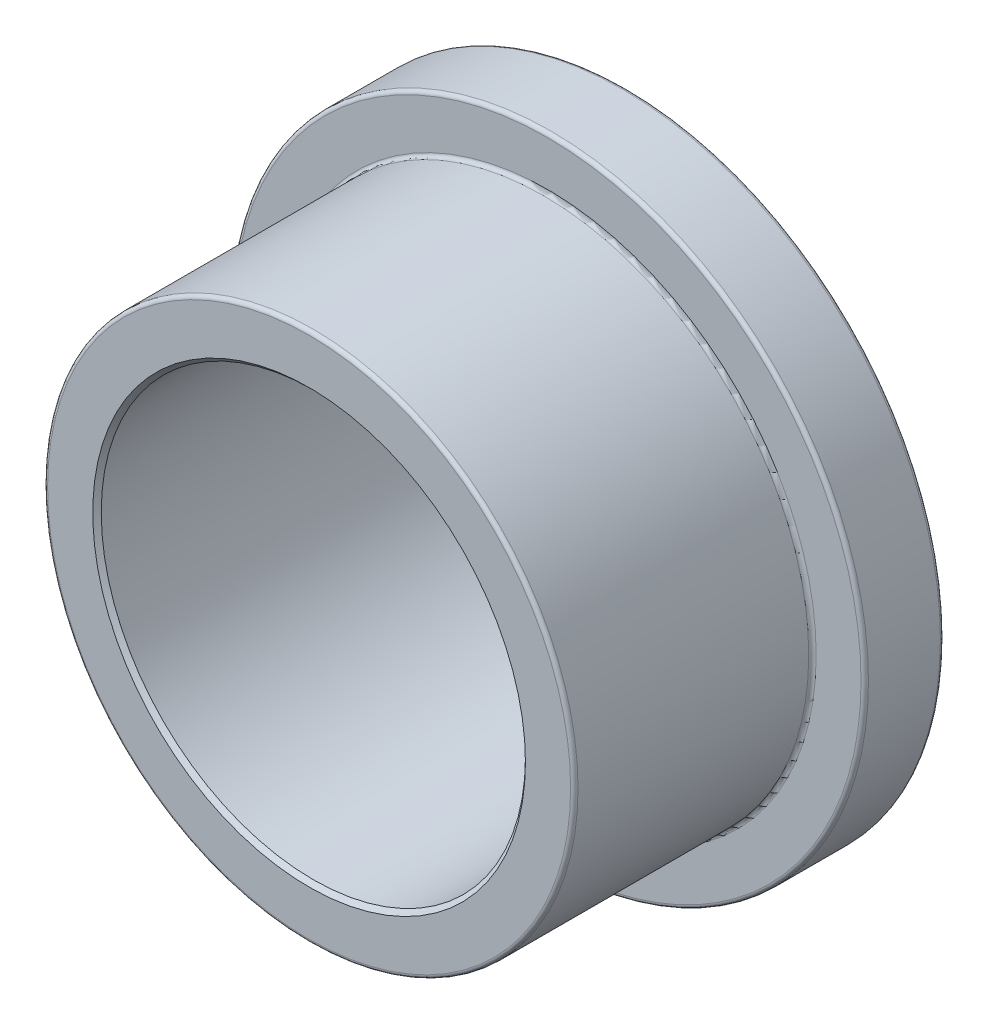
ISO-10303-21;
HEADER;
FILE_DESCRIPTION(('STEP AP214'),'2;1');
FILE_NAME('part.step','',(''),(''),'','','');
FILE_SCHEMA(('AUTOMOTIVE_DESIGN { 1 0 10303 214 1 1 1 1 }'));
ENDSEC;
DATA;
#1=APPLICATION_CONTEXT('core data for automotive mechanical design processes');
#2=APPLICATION_PROTOCOL_DEFINITION('international standard','automotive_design',2000,#1);
#3=PRODUCT_CONTEXT('',#1,'mechanical');
#4=PRODUCT('Part','Part','',(#3));
#5=PRODUCT_RELATED_PRODUCT_CATEGORY('part','',(#4));
#6=PRODUCT_DEFINITION_FORMATION('','',#4);
#7=PRODUCT_DEFINITION_CONTEXT('part definition',#1,'design');
#8=PRODUCT_DEFINITION('design','',#6,#7);
#9=PRODUCT_DEFINITION_SHAPE('','',#8);
#10=(LENGTH_UNIT() NAMED_UNIT(*) SI_UNIT(.MILLI.,.METRE.));
#11=(NAMED_UNIT(*) PLANE_ANGLE_UNIT() SI_UNIT($,.RADIAN.));
#12=(NAMED_UNIT(*) SI_UNIT($,.STERADIAN.) SOLID_ANGLE_UNIT());
#13=UNCERTAINTY_MEASURE_WITH_UNIT(LENGTH_MEASURE(1.E-05),#10,'distance_accuracy_value','');
#14=(GEOMETRIC_REPRESENTATION_CONTEXT(3) GLOBAL_UNCERTAINTY_ASSIGNED_CONTEXT((#13)) GLOBAL_UNIT_ASSIGNED_CONTEXT((#10,
#11,#12)) REPRESENTATION_CONTEXT('',''));
#15=CARTESIAN_POINT('',(0.,0.,0.));
#16=DIRECTION('',(0.,0.,1.));
#17=DIRECTION('',(1.,0.,0.));
#18=AXIS2_PLACEMENT_3D('',#15,#16,#17);
#19=CARTESIAN_POINT('',(0.,0.,19.05));
#20=DIRECTION('',(0.,0.,1.));
#21=DIRECTION('',(1.,0.,0.));
#22=AXIS2_PLACEMENT_3D('',#19,#20,#21);
#23=PLANE('',#22);
#24=CARTESIAN_POINT('',(0.,0.,19.05));
#25=DIRECTION('',(0.,0.,1.));
#26=DIRECTION('',(1.,0.,0.));
#27=AXIS2_PLACEMENT_3D('',#24,#25,#26);
#28=CIRCLE('',#27,15.6903166);
#29=CARTESIAN_POINT('',(15.6903166,0.,19.05));
#30=VERTEX_POINT('',#29);
#31=EDGE_CURVE('E10',#30,#30,#28,.T.);
#32=ORIENTED_EDGE('',*,*,#31,.T.);
#33=EDGE_LOOP('',(#32));
#34=FACE_BOUND('',#33,.T.);
#35=CARTESIAN_POINT('',(0.,0.,19.05));
#36=DIRECTION('',(0.,0.,1.));
#37=DIRECTION('',(1.,0.,0.));
#38=AXIS2_PLACEMENT_3D('',#35,#36,#37);
#39=CIRCLE('',#38,12.979908);
#40=CARTESIAN_POINT('',(12.979908,0.,19.05));
#41=VERTEX_POINT('',#40);
#42=EDGE_CURVE('E62',#41,#41,#39,.F.);
#43=ORIENTED_EDGE('',*,*,#42,.T.);
#44=EDGE_LOOP('',(#43));
#45=FACE_BOUND('',#44,.T.);
#46=ADVANCED_FACE('F30',(#34,#45),#23,.T.);
#47=CARTESIAN_POINT('',(0.,0.,0.));
#48=DIRECTION('',(0.,0.,1.));
#49=DIRECTION('',(1.,0.,0.));
#50=AXIS2_PLACEMENT_3D('',#47,#48,#49);
#51=PLANE('',#50);
#52=CARTESIAN_POINT('',(0.,0.,0.));
#53=DIRECTION('',(0.,0.,1.));
#54=DIRECTION('',(1.,0.,0.));
#55=AXIS2_PLACEMENT_3D('',#52,#53,#54);
#56=CIRCLE('',#55,18.8272166);
#57=CARTESIAN_POINT('',(18.8272166,0.,0.));
#58=VERTEX_POINT('',#57);
#59=EDGE_CURVE('E53',#58,#58,#56,.F.);
#60=ORIENTED_EDGE('',*,*,#59,.T.);
#61=EDGE_LOOP('',(#60));
#62=FACE_BOUND('',#61,.T.);
#63=CARTESIAN_POINT('',(0.,0.,0.));
#64=DIRECTION('',(0.,0.,1.));
#65=DIRECTION('',(1.,0.,0.));
#66=AXIS2_PLACEMENT_3D('',#63,#64,#65);
#67=CIRCLE('',#66,12.979908);
#68=CARTESIAN_POINT('',(12.979908,0.,0.));
#69=VERTEX_POINT('',#68);
#70=EDGE_CURVE('E71',#69,#69,#67,.T.);
#71=ORIENTED_EDGE('',*,*,#70,.T.);
#72=EDGE_LOOP('',(#71));
#73=FACE_BOUND('',#72,.T.);
#74=ADVANCED_FACE('F75',(#62,#73),#51,.F.);
#75=CARTESIAN_POINT('',(0.,0.,19.05));
#76=DIRECTION('',(0.,0.,-1.));
#77=DIRECTION('',(-1.,0.,0.));
#78=AXIS2_PLACEMENT_3D('',#75,#76,#77);
#79=CYLINDRICAL_SURFACE('',#78,15.9131);
#80=CARTESIAN_POINT('',(0.,0.,4.9852834));
#81=DIRECTION('',(0.,0.,1.));
#82=DIRECTION('',(1.,0.,0.));
#83=AXIS2_PLACEMENT_3D('',#80,#81,#82);
#84=CIRCLE('',#83,15.9131);
#85=CARTESIAN_POINT('',(-15.9131,0.,4.9852834));
#86=VERTEX_POINT('',#85);
#87=EDGE_CURVE('E37',#86,#86,#84,.T.);
#88=CARTESIAN_POINT('',(0.,0.,18.8272166));
#89=DIRECTION('',(0.,0.,1.));
#90=DIRECTION('',(1.,0.,0.));
#91=AXIS2_PLACEMENT_3D('',#88,#89,#90);
#92=CIRCLE('',#91,15.9131);
#93=CARTESIAN_POINT('',(-15.9131,0.,18.8272166));
#94=VERTEX_POINT('',#93);
#95=EDGE_CURVE('E41',#94,#94,#92,.F.);
#96=CARTESIAN_POINT('',(-15.9131,0.,4.9852834));
#97=CARTESIAN_POINT('',(-15.9131,0.,5.12947020416667));
#98=CARTESIAN_POINT('',(-15.9131,0.,5.27365700833333));
#99=CARTESIAN_POINT('',(-15.9131,0.,5.56203061666667));
#100=CARTESIAN_POINT('',(-15.9131,0.,5.70621742083333));
#101=CARTESIAN_POINT('',(-15.9131,0.,5.99459102916667));
#102=CARTESIAN_POINT('',(-15.9131,0.,6.13877783333333));
#103=CARTESIAN_POINT('',(-15.9131,0.,6.42715144166667));
#104=CARTESIAN_POINT('',(-15.9131,0.,6.57133824583333));
#105=CARTESIAN_POINT('',(-15.9131,0.,6.85971185416667));
#106=CARTESIAN_POINT('',(-15.9131,0.,7.00389865833333));
#107=CARTESIAN_POINT('',(-15.9131,0.,7.29227226666667));
#108=CARTESIAN_POINT('',(-15.9131,0.,7.43645907083333));
#109=CARTESIAN_POINT('',(-15.9131,0.,7.72483267916666));
#110=CARTESIAN_POINT('',(-15.9131,0.,7.86901948333333));
#111=CARTESIAN_POINT('',(-15.9131,0.,8.15739309166666));
#112=CARTESIAN_POINT('',(-15.9131,0.,8.30157989583333));
#113=CARTESIAN_POINT('',(-15.9131,0.,8.58995350416666));
#114=CARTESIAN_POINT('',(-15.9131,0.,8.73414030833333));
#115=CARTESIAN_POINT('',(-15.9131,0.,9.02251391666666));
#116=CARTESIAN_POINT('',(-15.9131,0.,9.16670072083333));
#117=CARTESIAN_POINT('',(-15.9131,0.,9.45507432916666));
#118=CARTESIAN_POINT('',(-15.9131,0.,9.59926113333333));
#119=CARTESIAN_POINT('',(-15.9131,0.,9.88763474166666));
#120=CARTESIAN_POINT('',(-15.9131,0.,10.0318215458333));
#121=CARTESIAN_POINT('',(-15.9131,0.,10.3201951541667));
#122=CARTESIAN_POINT('',(-15.9131,0.,10.4643819583333));
#123=CARTESIAN_POINT('',(-15.9131,0.,10.7527555666667));
#124=CARTESIAN_POINT('',(-15.9131,0.,10.8969423708333));
#125=CARTESIAN_POINT('',(-15.9131,0.,11.1853159791667));
#126=CARTESIAN_POINT('',(-15.9131,0.,11.3295027833333));
#127=CARTESIAN_POINT('',(-15.9131,0.,11.6178763916667));
#128=CARTESIAN_POINT('',(-15.9131,0.,11.7620631958333));
#129=CARTESIAN_POINT('',(-15.9131,0.,12.0504368041667));
#130=CARTESIAN_POINT('',(-15.9131,0.,12.1946236083333));
#131=CARTESIAN_POINT('',(-15.9131,0.,12.4829972166667));
#132=CARTESIAN_POINT('',(-15.9131,0.,12.6271840208333));
#133=CARTESIAN_POINT('',(-15.9131,0.,12.9155576291667));
#134=CARTESIAN_POINT('',(-15.9131,0.,13.0597444333333));
#135=CARTESIAN_POINT('',(-15.9131,0.,13.3481180416667));
#136=CARTESIAN_POINT('',(-15.9131,0.,13.4923048458333));
#137=CARTESIAN_POINT('',(-15.9131,0.,13.7806784541667));
#138=CARTESIAN_POINT('',(-15.9131,0.,13.9248652583333));
#139=CARTESIAN_POINT('',(-15.9131,0.,14.2132388666667));
#140=CARTESIAN_POINT('',(-15.9131,0.,14.3574256708333));
#141=CARTESIAN_POINT('',(-15.9131,0.,14.6457992791667));
#142=CARTESIAN_POINT('',(-15.9131,0.,14.7899860833333));
#143=CARTESIAN_POINT('',(-15.9131,0.,15.0783596916667));
#144=CARTESIAN_POINT('',(-15.9131,0.,15.2225464958333));
#145=CARTESIAN_POINT('',(-15.9131,0.,15.5109201041667));
#146=CARTESIAN_POINT('',(-15.9131,0.,15.6551069083333));
#147=CARTESIAN_POINT('',(-15.9131,0.,15.9434805166667));
#148=CARTESIAN_POINT('',(-15.9131,0.,16.0876673208333));
#149=CARTESIAN_POINT('',(-15.9131,0.,16.3760409291667));
#150=CARTESIAN_POINT('',(-15.9131,0.,16.5202277333333));
#151=CARTESIAN_POINT('',(-15.9131,0.,16.8086013416667));
#152=CARTESIAN_POINT('',(-15.9131,0.,16.9527881458333));
#153=CARTESIAN_POINT('',(-15.9131,0.,17.2411617541667));
#154=CARTESIAN_POINT('',(-15.9131,0.,17.3853485583333));
#155=CARTESIAN_POINT('',(-15.9131,0.,17.6737221666667));
#156=CARTESIAN_POINT('',(-15.9131,0.,17.8179089708333));
#157=CARTESIAN_POINT('',(-15.9131,0.,18.1062825791667));
#158=CARTESIAN_POINT('',(-15.9131,0.,18.2504693833333));
#159=CARTESIAN_POINT('',(-15.9131,0.,18.5388429916667));
#160=CARTESIAN_POINT('',(-15.9131,0.,18.6830297958333));
#161=CARTESIAN_POINT('',(-15.9131,0.,18.8272166));
#162=B_SPLINE_CURVE_WITH_KNOTS('',3,(#96,#97,#98,#99,#100,#101,#102,#103,#104,#105,#106,#107,
#108,#109,#110,#111,#112,#113,#114,#115,#116,#117,#118,#119,#120,#121,#122,#123,#124,#125,#126,
#127,#128,#129,#130,#131,#132,#133,#134,#135,#136,#137,#138,#139,#140,#141,#142,#143,#144,#145,
#146,#147,#148,#149,#150,#151,#152,#153,#154,#155,#156,#157,#158,#159,#160,#161),.UNSPECIFIED.,
.F.,.F.,(4,2,2,2,2,2,2,2,2,2,2,2,2,2,2,2,2,2,2,2,2,2,2,2,2,2,2,2,2,2,2,2,4),(0.,0.4325604125,
0.865120824999999,1.2976812375,1.73024165,2.1628020625,2.595362475,3.0279228875,3.4604833,
3.8930437125,4.325604125,4.7581645375,5.19072495,5.6232853625,6.055845775,6.4884061875,
6.92096659999999,7.35352701249999,7.78608742499999,8.21864783749999,8.65120824999999,
9.08376866249999,9.51632907499999,9.94888948749999,10.3814499,10.8140103125,11.246570725,
11.6791311375,12.11169155,12.5442519625,12.976812375,13.4093727875,13.8419332),.UNSPECIFIED.);
#163=EDGE_CURVE('BSEAM100',#86,#94,#162,.T.);
#164=ORIENTED_EDGE('',*,*,#87,.T.);
#165=ORIENTED_EDGE('',*,*,#95,.T.);
#166=ORIENTED_EDGE('',*,*,#163,.T.);
#167=ORIENTED_EDGE('',*,*,#163,.F.);
#168=EDGE_LOOP('',(#164,#166,#165,#167));
#169=FACE_BOUND('',#168,.T.);
#170=ADVANCED_FACE('F100',(#169),#79,.T.);
#171=CARTESIAN_POINT('',(0.,0.,19.05));
#172=DIRECTION('',(0.,0.,-1.));
#173=DIRECTION('',(-1.,0.,0.));
#174=AXIS2_PLACEMENT_3D('',#171,#172,#173);
#175=CYLINDRICAL_SURFACE('',#174,12.7254);
#176=CARTESIAN_POINT('',(0.,0.,0.25450799999998));
#177=DIRECTION('',(0.,0.,1.));
#178=DIRECTION('',(1.,0.,0.));
#179=AXIS2_PLACEMENT_3D('',#176,#177,#178);
#180=CIRCLE('',#179,12.7254);
#181=CARTESIAN_POINT('',(-12.7254,0.,0.254507999999976));
#182=VERTEX_POINT('',#181);
#183=EDGE_CURVE('E65',#182,#182,#180,.F.);
#184=CARTESIAN_POINT('',(0.,0.,18.795492));
#185=DIRECTION('',(0.,0.,1.));
#186=DIRECTION('',(1.,0.,0.));
#187=AXIS2_PLACEMENT_3D('',#184,#185,#186);
#188=CIRCLE('',#187,12.7254);
#189=CARTESIAN_POINT('',(-12.7254,0.,18.795492));
#190=VERTEX_POINT('',#189);
#191=EDGE_CURVE('E68',#190,#190,#188,.T.);
#192=CARTESIAN_POINT('',(-12.7254,0.,0.254507999999976));
#193=CARTESIAN_POINT('',(-12.7254,0.,0.447643249999977));
#194=CARTESIAN_POINT('',(-12.7254,0.,0.640778499999977));
#195=CARTESIAN_POINT('',(-12.7254,0.,1.02704899999998));
#196=CARTESIAN_POINT('',(-12.7254,0.,1.22018424999998));
#197=CARTESIAN_POINT('',(-12.7254,0.,1.60645474999998));
#198=CARTESIAN_POINT('',(-12.7254,0.,1.79958999999998));
#199=CARTESIAN_POINT('',(-12.7254,0.,2.18586049999998));
#200=CARTESIAN_POINT('',(-12.7254,0.,2.37899574999997));
#201=CARTESIAN_POINT('',(-12.7254,0.,2.76526624999997));
#202=CARTESIAN_POINT('',(-12.7254,0.,2.95840149999998));
#203=CARTESIAN_POINT('',(-12.7254,0.,3.34467199999997));
#204=CARTESIAN_POINT('',(-12.7254,0.,3.53780724999997));
#205=CARTESIAN_POINT('',(-12.7254,0.,3.92407774999997));
#206=CARTESIAN_POINT('',(-12.7254,0.,4.11721299999997));
#207=CARTESIAN_POINT('',(-12.7254,0.,4.50348349999997));
#208=CARTESIAN_POINT('',(-12.7254,0.,4.69661874999997));
#209=CARTESIAN_POINT('',(-12.7254,0.,5.08288924999997));
#210=CARTESIAN_POINT('',(-12.7254,0.,5.27602449999997));
#211=CARTESIAN_POINT('',(-12.7254,0.,5.66229499999997));
#212=CARTESIAN_POINT('',(-12.7254,0.,5.85543024999997));
#213=CARTESIAN_POINT('',(-12.7254,0.,6.24170074999997));
#214=CARTESIAN_POINT('',(-12.7254,0.,6.43483599999997));
#215=CARTESIAN_POINT('',(-12.7254,0.,6.82110649999997));
#216=CARTESIAN_POINT('',(-12.7254,0.,7.01424174999997));
#217=CARTESIAN_POINT('',(-12.7254,0.,7.40051224999997));
#218=CARTESIAN_POINT('',(-12.7254,0.,7.59364749999997));
#219=CARTESIAN_POINT('',(-12.7254,0.,7.97991799999997));
#220=CARTESIAN_POINT('',(-12.7254,0.,8.17305324999997));
#221=CARTESIAN_POINT('',(-12.7254,0.,8.55932374999997));
#222=CARTESIAN_POINT('',(-12.7254,0.,8.75245899999997));
#223=CARTESIAN_POINT('',(-12.7254,0.,9.13872949999997));
#224=CARTESIAN_POINT('',(-12.7254,0.,9.33186474999997));
#225=CARTESIAN_POINT('',(-12.7254,0.,9.71813524999997));
#226=CARTESIAN_POINT('',(-12.7254,0.,9.91127049999997));
#227=CARTESIAN_POINT('',(-12.7254,0.,10.297541));
#228=CARTESIAN_POINT('',(-12.7254,0.,10.49067625));
#229=CARTESIAN_POINT('',(-12.7254,0.,10.87694675));
#230=CARTESIAN_POINT('',(-12.7254,0.,11.070082));
#231=CARTESIAN_POINT('',(-12.7254,0.,11.4563525));
#232=CARTESIAN_POINT('',(-12.7254,0.,11.64948775));
#233=CARTESIAN_POINT('',(-12.7254,0.,12.03575825));
#234=CARTESIAN_POINT('',(-12.7254,0.,12.2288935));
#235=CARTESIAN_POINT('',(-12.7254,0.,12.615164));
#236=CARTESIAN_POINT('',(-12.7254,0.,12.80829925));
#237=CARTESIAN_POINT('',(-12.7254,0.,13.19456975));
#238=CARTESIAN_POINT('',(-12.7254,0.,13.387705));
#239=CARTESIAN_POINT('',(-12.7254,0.,13.7739755));
#240=CARTESIAN_POINT('',(-12.7254,0.,13.96711075));
#241=CARTESIAN_POINT('',(-12.7254,0.,14.35338125));
#242=CARTESIAN_POINT('',(-12.7254,0.,14.5465165));
#243=CARTESIAN_POINT('',(-12.7254,0.,14.932787));
#244=CARTESIAN_POINT('',(-12.7254,0.,15.12592225));
#245=CARTESIAN_POINT('',(-12.7254,0.,15.51219275));
#246=CARTESIAN_POINT('',(-12.7254,0.,15.705328));
#247=CARTESIAN_POINT('',(-12.7254,0.,16.0915985));
#248=CARTESIAN_POINT('',(-12.7254,0.,16.28473375));
#249=CARTESIAN_POINT('',(-12.7254,0.,16.67100425));
#250=CARTESIAN_POINT('',(-12.7254,0.,16.8641395));
#251=CARTESIAN_POINT('',(-12.7254,0.,17.25041));
#252=CARTESIAN_POINT('',(-12.7254,0.,17.44354525));
#253=CARTESIAN_POINT('',(-12.7254,0.,17.82981575));
#254=CARTESIAN_POINT('',(-12.7254,0.,18.022951));
#255=CARTESIAN_POINT('',(-12.7254,0.,18.4092215));
#256=CARTESIAN_POINT('',(-12.7254,0.,18.60235675));
#257=CARTESIAN_POINT('',(-12.7254,0.,18.795492));
#258=B_SPLINE_CURVE_WITH_KNOTS('',3,(#192,#193,#194,#195,#196,#197,#198,#199,#200,#201,#202,
#203,#204,#205,#206,#207,#208,#209,#210,#211,#212,#213,#214,#215,#216,#217,#218,#219,#220,#221,
#222,#223,#224,#225,#226,#227,#228,#229,#230,#231,#232,#233,#234,#235,#236,#237,#238,#239,#240,
#241,#242,#243,#244,#245,#246,#247,#248,#249,#250,#251,#252,#253,#254,#255,#256,#257),
.UNSPECIFIED.,.F.,.F.,(4,2,2,2,2,2,2,2,2,2,2,2,2,2,2,2,2,2,2,2,2,2,2,2,2,2,2,2,2,2,2,2,4),(0.,
0.579405750000001,1.1588115,1.73821725,2.317623,2.89702875,3.47643449999999,4.05584025,
4.63524599999999,5.21465175,5.79405749999999,6.37346324999999,6.95286899999999,7.53227474999999,
8.11168049999999,8.69108624999999,9.27049199999999,9.84989774999999,10.4293035,11.00870925,
11.588115,12.16752075,12.7469265,13.32633225,13.905738,14.48514375,15.0645495,15.64395525,
16.223361,16.80276675,17.3821725,17.96157825,18.540984),.UNSPECIFIED.);
#259=EDGE_CURVE('BSEAM105',#182,#190,#258,.T.);
#260=ORIENTED_EDGE('',*,*,#183,.T.);
#261=ORIENTED_EDGE('',*,*,#191,.T.);
#262=ORIENTED_EDGE('',*,*,#259,.T.);
#263=ORIENTED_EDGE('',*,*,#259,.F.);
#264=EDGE_LOOP('',(#260,#262,#261,#263));
#265=FACE_BOUND('',#264,.T.);
#266=ADVANCED_FACE('F105',(#265),#175,.F.);
#267=CARTESIAN_POINT('',(0.,0.,4.7625));
#268=DIRECTION('',(0.,0.,1.));
#269=DIRECTION('',(1.,0.,0.));
#270=AXIS2_PLACEMENT_3D('',#267,#268,#269);
#271=PLANE('',#270);
#272=CARTESIAN_POINT('',(0.,0.,4.7625));
#273=DIRECTION('',(0.,0.,1.));
#274=DIRECTION('',(1.,0.,0.));
#275=AXIS2_PLACEMENT_3D('',#272,#273,#274);
#276=CIRCLE('',#275,18.8272166);
#277=CARTESIAN_POINT('',(18.8272166,0.,4.7625));
#278=VERTEX_POINT('',#277);
#279=EDGE_CURVE('E45',#278,#278,#276,.T.);
#280=ORIENTED_EDGE('',*,*,#279,.T.);
#281=EDGE_LOOP('',(#280));
#282=FACE_BOUND('',#281,.T.);
#283=CARTESIAN_POINT('',(0.,0.,4.7625));
#284=DIRECTION('',(0.,0.,1.));
#285=DIRECTION('',(1.,0.,0.));
#286=AXIS2_PLACEMENT_3D('',#283,#284,#285);
#287=CIRCLE('',#286,16.1358834);
#288=CARTESIAN_POINT('',(16.1358834,0.,4.7625));
#289=VERTEX_POINT('',#288);
#290=EDGE_CURVE('E50',#289,#289,#287,.F.);
#291=ORIENTED_EDGE('',*,*,#290,.T.);
#292=EDGE_LOOP('',(#291));
#293=FACE_BOUND('',#292,.T.);
#294=ADVANCED_FACE('F90',(#282,#293),#271,.T.);
#295=CARTESIAN_POINT('',(0.,0.,4.7625));
#296=DIRECTION('',(0.,0.,-1.));
#297=DIRECTION('',(-1.,0.,0.));
#298=AXIS2_PLACEMENT_3D('',#295,#296,#297);
#299=CYLINDRICAL_SURFACE('',#298,19.05);
#300=CARTESIAN_POINT('',(0.,0.,0.2227834));
#301=DIRECTION('',(0.,0.,1.));
#302=DIRECTION('',(1.,0.,0.));
#303=AXIS2_PLACEMENT_3D('',#300,#301,#302);
#304=CIRCLE('',#303,19.05);
#305=CARTESIAN_POINT('',(-19.05,0.,0.222783399999999));
#306=VERTEX_POINT('',#305);
#307=EDGE_CURVE('E56',#306,#306,#304,.T.);
#308=CARTESIAN_POINT('',(0.,0.,4.5397166));
#309=DIRECTION('',(0.,0.,1.));
#310=DIRECTION('',(1.,0.,0.));
#311=AXIS2_PLACEMENT_3D('',#308,#309,#310);
#312=CIRCLE('',#311,19.05);
#313=CARTESIAN_POINT('',(-19.05,0.,4.5397166));
#314=VERTEX_POINT('',#313);
#315=EDGE_CURVE('E59',#314,#314,#312,.F.);
#316=CARTESIAN_POINT('',(-19.05,0.,0.222783399999999));
#317=CARTESIAN_POINT('',(-19.05,0.,0.267751454166666));
#318=CARTESIAN_POINT('',(-19.05,0.,0.312719508333333));
#319=CARTESIAN_POINT('',(-19.05,0.,0.402655616666666));
#320=CARTESIAN_POINT('',(-19.05,0.,0.447623670833332));
#321=CARTESIAN_POINT('',(-19.05,0.,0.537559779166666));
#322=CARTESIAN_POINT('',(-19.05,0.,0.582527833333333));
#323=CARTESIAN_POINT('',(-19.05,0.,0.672463941666666));
#324=CARTESIAN_POINT('',(-19.05,0.,0.717431995833332));
#325=CARTESIAN_POINT('',(-19.05,0.,0.807368104166665));
#326=CARTESIAN_POINT('',(-19.05,0.,0.852336158333332));
#327=CARTESIAN_POINT('',(-19.05,0.,0.942272266666666));
#328=CARTESIAN_POINT('',(-19.05,0.,0.987240320833332));
#329=CARTESIAN_POINT('',(-19.05,0.,1.07717642916667));
#330=CARTESIAN_POINT('',(-19.05,0.,1.12214448333333));
#331=CARTESIAN_POINT('',(-19.05,0.,1.21208059166667));
#332=CARTESIAN_POINT('',(-19.05,0.,1.25704864583333));
#333=CARTESIAN_POINT('',(-19.05,0.,1.34698475416667));
#334=CARTESIAN_POINT('',(-19.05,0.,1.39195280833333));
#335=CARTESIAN_POINT('',(-19.05,0.,1.48188891666667));
#336=CARTESIAN_POINT('',(-19.05,0.,1.52685697083333));
#337=CARTESIAN_POINT('',(-19.05,0.,1.61679307916667));
#338=CARTESIAN_POINT('',(-19.05,0.,1.66176113333333));
#339=CARTESIAN_POINT('',(-19.05,0.,1.75169724166667));
#340=CARTESIAN_POINT('',(-19.05,0.,1.79666529583333));
#341=CARTESIAN_POINT('',(-19.05,0.,1.88660140416667));
#342=CARTESIAN_POINT('',(-19.05,0.,1.93156945833333));
#343=CARTESIAN_POINT('',(-19.05,0.,2.02150556666667));
#344=CARTESIAN_POINT('',(-19.05,0.,2.06647362083333));
#345=CARTESIAN_POINT('',(-19.05,0.,2.15640972916667));
#346=CARTESIAN_POINT('',(-19.05,0.,2.20137778333333));
#347=CARTESIAN_POINT('',(-19.05,0.,2.29131389166667));
#348=CARTESIAN_POINT('',(-19.05,0.,2.33628194583333));
#349=CARTESIAN_POINT('',(-19.05,0.,2.42621805416667));
#350=CARTESIAN_POINT('',(-19.05,0.,2.47118610833333));
#351=CARTESIAN_POINT('',(-19.05,0.,2.56112221666667));
#352=CARTESIAN_POINT('',(-19.05,0.,2.60609027083333));
#353=CARTESIAN_POINT('',(-19.05,0.,2.69602637916667));
#354=CARTESIAN_POINT('',(-19.05,0.,2.74099443333333));
#355=CARTESIAN_POINT('',(-19.05,0.,2.83093054166667));
#356=CARTESIAN_POINT('',(-19.05,0.,2.87589859583333));
#357=CARTESIAN_POINT('',(-19.05,0.,2.96583470416667));
#358=CARTESIAN_POINT('',(-19.05,0.,3.01080275833333));
#359=CARTESIAN_POINT('',(-19.05,0.,3.10073886666667));
#360=CARTESIAN_POINT('',(-19.05,0.,3.14570692083333));
#361=CARTESIAN_POINT('',(-19.05,0.,3.23564302916667));
#362=CARTESIAN_POINT('',(-19.05,0.,3.28061108333333));
#363=CARTESIAN_POINT('',(-19.05,0.,3.37054719166667));
#364=CARTESIAN_POINT('',(-19.05,0.,3.41551524583333));
#365=CARTESIAN_POINT('',(-19.05,0.,3.50545135416667));
#366=CARTESIAN_POINT('',(-19.05,0.,3.55041940833333));
#367=CARTESIAN_POINT('',(-19.05,0.,3.64035551666667));
#368=CARTESIAN_POINT('',(-19.05,0.,3.68532357083333));
#369=CARTESIAN_POINT('',(-19.05,0.,3.77525967916667));
#370=CARTESIAN_POINT('',(-19.05,0.,3.82022773333333));
#371=CARTESIAN_POINT('',(-19.05,0.,3.91016384166667));
#372=CARTESIAN_POINT('',(-19.05,0.,3.95513189583333));
#373=CARTESIAN_POINT('',(-19.05,0.,4.04506800416667));
#374=CARTESIAN_POINT('',(-19.05,0.,4.09003605833333));
#375=CARTESIAN_POINT('',(-19.05,0.,4.17997216666667));
#376=CARTESIAN_POINT('',(-19.05,0.,4.22494022083333));
#377=CARTESIAN_POINT('',(-19.05,0.,4.31487632916667));
#378=CARTESIAN_POINT('',(-19.05,0.,4.35984438333333));
#379=CARTESIAN_POINT('',(-19.05,0.,4.44978049166667));
#380=CARTESIAN_POINT('',(-19.05,0.,4.49474854583333));
#381=CARTESIAN_POINT('',(-19.05,0.,4.5397166));
#382=B_SPLINE_CURVE_WITH_KNOTS('',3,(#316,#317,#318,#319,#320,#321,#322,#323,#324,#325,#326,
#327,#328,#329,#330,#331,#332,#333,#334,#335,#336,#337,#338,#339,#340,#341,#342,#343,#344,#345,
#346,#347,#348,#349,#350,#351,#352,#353,#354,#355,#356,#357,#358,#359,#360,#361,#362,#363,#364,
#365,#366,#367,#368,#369,#370,#371,#372,#373,#374,#375,#376,#377,#378,#379,#380,#381),
.UNSPECIFIED.,.F.,.F.,(4,2,2,2,2,2,2,2,2,2,2,2,2,2,2,2,2,2,2,2,2,2,2,2,2,2,2,2,2,2,2,2,4),(0.,
0.1349041625,0.269808325,0.4047124875,0.53961665,0.6745208125,0.809424975,0.9443291375,
1.0792333,1.2141374625,1.349041625,1.4839457875,1.61884995,1.7537541125,1.888658275,
2.0235624375,2.1584666,2.2933707625,2.428274925,2.5631790875,2.69808325,2.8329874125,
2.967891575,3.1027957375,3.2376999,3.3726040625,3.507508225,3.6424123875,3.77731655,
3.9122207125,4.047124875,4.1820290375,4.3169332),.UNSPECIFIED.);
#383=EDGE_CURVE('BSEAM80',#306,#314,#382,.T.);
#384=ORIENTED_EDGE('',*,*,#307,.T.);
#385=ORIENTED_EDGE('',*,*,#315,.T.);
#386=ORIENTED_EDGE('',*,*,#383,.T.);
#387=ORIENTED_EDGE('',*,*,#383,.F.);
#388=EDGE_LOOP('',(#384,#386,#385,#387));
#389=FACE_BOUND('',#388,.T.);
#390=ADVANCED_FACE('F80',(#389),#299,.T.);
#391=CARTESIAN_POINT('',(0.,0.,0.));
#392=DIRECTION('',(0.,0.,-1.));
#393=DIRECTION('',(-1.,0.,0.));
#394=AXIS2_PLACEMENT_3D('',#391,#392,#393);
#395=CONICAL_SURFACE('',#394,12.979908,0.785398163397442);
#396=ORIENTED_EDGE('',*,*,#183,.F.);
#397=EDGE_LOOP('',(#396));
#398=FACE_BOUND('',#397,.T.);
#399=ORIENTED_EDGE('',*,*,#70,.F.);
#400=EDGE_LOOP('',(#399));
#401=FACE_BOUND('',#400,.T.);
#402=ADVANCED_FACE('F77',(#398,#401),#395,.F.);
#403=CARTESIAN_POINT('',(0.,0.,18.795492));
#404=DIRECTION('',(0.,0.,1.));
#405=DIRECTION('',(1.,0.,0.));
#406=AXIS2_PLACEMENT_3D('',#403,#404,#405);
#407=CONICAL_SURFACE('',#406,12.7254,0.785398163397442);
#408=ORIENTED_EDGE('',*,*,#42,.F.);
#409=EDGE_LOOP('',(#408));
#410=FACE_BOUND('',#409,.T.);
#411=ORIENTED_EDGE('',*,*,#191,.F.);
#412=EDGE_LOOP('',(#411));
#413=FACE_BOUND('',#412,.T.);
#414=ADVANCED_FACE('F79',(#410,#413),#407,.F.);
#415=CARTESIAN_POINT('',(0.,0.,0.2227834));
#416=DIRECTION('',(0.,0.,1.));
#417=DIRECTION('',(1.,0.,0.));
#418=AXIS2_PLACEMENT_3D('',#415,#416,#417);
#419=TOROIDAL_SURFACE('',#418,18.8272166,0.2227834);
#420=ORIENTED_EDGE('',*,*,#59,.F.);
#421=EDGE_LOOP('',(#420));
#422=FACE_BOUND('',#421,.T.);
#423=ORIENTED_EDGE('',*,*,#307,.F.);
#424=EDGE_LOOP('',(#423));
#425=FACE_BOUND('',#424,.T.);
#426=ADVANCED_FACE('F87',(#422,#425),#419,.T.);
#427=CARTESIAN_POINT('',(0.,0.,4.5397166));
#428=DIRECTION('',(0.,0.,1.));
#429=DIRECTION('',(1.,0.,0.));
#430=AXIS2_PLACEMENT_3D('',#427,#428,#429);
#431=TOROIDAL_SURFACE('',#430,18.8272166,0.2227834);
#432=ORIENTED_EDGE('',*,*,#315,.F.);
#433=EDGE_LOOP('',(#432));
#434=FACE_BOUND('',#433,.T.);
#435=ORIENTED_EDGE('',*,*,#279,.F.);
#436=EDGE_LOOP('',(#435));
#437=FACE_BOUND('',#436,.T.);
#438=ADVANCED_FACE('F120',(#434,#437),#431,.T.);
#439=CARTESIAN_POINT('',(0.,0.,4.9852834));
#440=DIRECTION('',(0.,0.,1.));
#441=DIRECTION('',(1.,0.,0.));
#442=AXIS2_PLACEMENT_3D('',#439,#440,#441);
#443=TOROIDAL_SURFACE('',#442,16.1358834,0.2227834);
#444=ORIENTED_EDGE('',*,*,#290,.F.);
#445=EDGE_LOOP('',(#444));
#446=FACE_BOUND('',#445,.T.);
#447=ORIENTED_EDGE('',*,*,#87,.F.);
#448=EDGE_LOOP('',(#447));
#449=FACE_BOUND('',#448,.T.);
#450=ADVANCED_FACE('F116',(#446,#449),#443,.F.);
#451=CARTESIAN_POINT('',(0.,0.,18.8272166));
#452=DIRECTION('',(0.,0.,1.));
#453=DIRECTION('',(1.,0.,0.));
#454=AXIS2_PLACEMENT_3D('',#451,#452,#453);
#455=TOROIDAL_SURFACE('',#454,15.6903166,0.2227834);
#456=ORIENTED_EDGE('',*,*,#95,.F.);
#457=EDGE_LOOP('',(#456));
#458=FACE_BOUND('',#457,.T.);
#459=ORIENTED_EDGE('',*,*,#31,.F.);
#460=EDGE_LOOP('',(#459));
#461=FACE_BOUND('',#460,.T.);
#462=ADVANCED_FACE('F32',(#458,#461),#455,.T.);
#463=CLOSED_SHELL('',(#46,#74,#170,#266,#294,#390,#402,#414,#426,#438,#450,#462));
#464=MANIFOLD_SOLID_BREP('B2',#463);
#465=ADVANCED_BREP_SHAPE_REPRESENTATION('',(#18,#464),#14);
#466=SHAPE_DEFINITION_REPRESENTATION(#9,#465);
ENDSEC;
END-ISO-10303-21;
